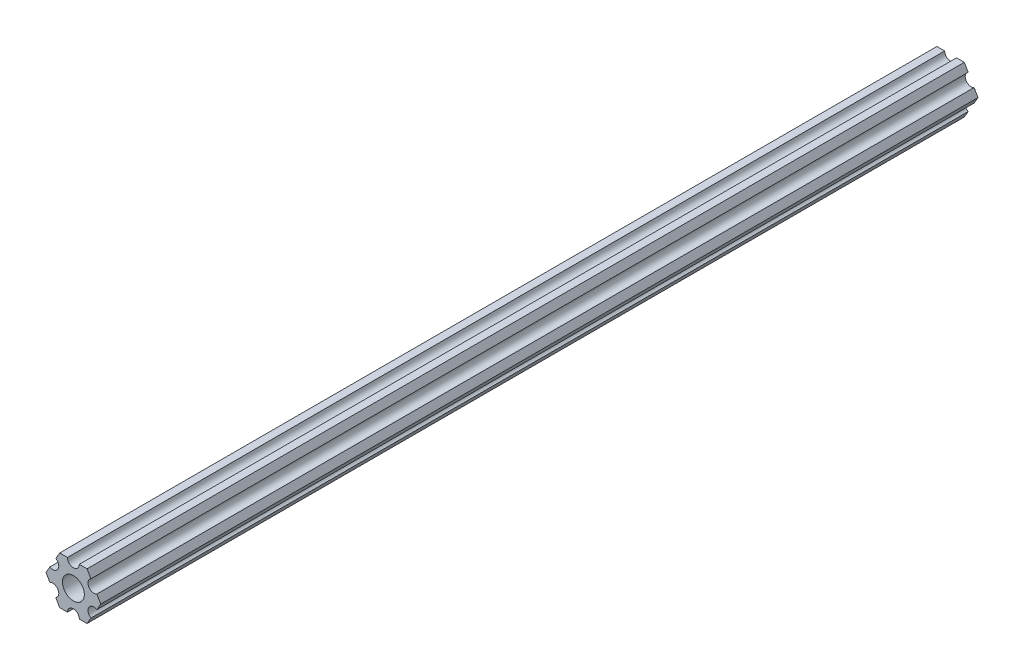
ISO-10303-21;
HEADER;
FILE_DESCRIPTION(('STEP AP214'),'2;1');
FILE_NAME('part.step','',(''),(''),'','','');
FILE_SCHEMA(('AUTOMOTIVE_DESIGN { 1 0 10303 214 1 1 1 1 }'));
ENDSEC;
DATA;
#1=APPLICATION_CONTEXT('core data for automotive mechanical design processes');
#2=APPLICATION_PROTOCOL_DEFINITION('international standard','automotive_design',2000,#1);
#3=PRODUCT_CONTEXT('',#1,'mechanical');
#4=PRODUCT('Part','Part','',(#3));
#5=PRODUCT_RELATED_PRODUCT_CATEGORY('part','',(#4));
#6=PRODUCT_DEFINITION_FORMATION('','',#4);
#7=PRODUCT_DEFINITION_CONTEXT('part definition',#1,'design');
#8=PRODUCT_DEFINITION('design','',#6,#7);
#9=PRODUCT_DEFINITION_SHAPE('','',#8);
#10=(LENGTH_UNIT() NAMED_UNIT(*) SI_UNIT(.MILLI.,.METRE.));
#11=(NAMED_UNIT(*) PLANE_ANGLE_UNIT() SI_UNIT($,.RADIAN.));
#12=(NAMED_UNIT(*) SI_UNIT($,.STERADIAN.) SOLID_ANGLE_UNIT());
#13=UNCERTAINTY_MEASURE_WITH_UNIT(LENGTH_MEASURE(1.E-05),#10,'distance_accuracy_value','');
#14=(GEOMETRIC_REPRESENTATION_CONTEXT(3) GLOBAL_UNCERTAINTY_ASSIGNED_CONTEXT((#13)) GLOBAL_UNIT_ASSIGNED_CONTEXT((#10,
#11,#12)) REPRESENTATION_CONTEXT('',''));
#15=CARTESIAN_POINT('',(0.,0.,0.));
#16=DIRECTION('',(0.,0.,1.));
#17=DIRECTION('',(1.,0.,0.));
#18=AXIS2_PLACEMENT_3D('',#15,#16,#17);
#19=CARTESIAN_POINT('',(6.29301142309098,-1.80018429024546,85.725));
#20=DIRECTION('',(-0.866025434075723,0.499999947533953,0.));
#21=DIRECTION('',(0.,0.,1.));
#22=AXIS2_PLACEMENT_3D('',#19,#20,#21);
#23=PLANE('',#22);
#24=DIRECTION('',(0.,0.,1.));
#25=VECTOR('',#24,1.);
#26=CARTESIAN_POINT('',(7.33234841870827,4.44212519169686E-07,85.725));
#27=LINE('',#26,#25);
#28=CARTESIAN_POINT('',(7.33234841870826,4.44212518961143E-07,-149.225));
#29=VERTEX_POINT('',#28);
#30=CARTESIAN_POINT('',(7.33234841870826,4.44212519315656E-07,85.725));
#31=VERTEX_POINT('',#30);
#32=EDGE_CURVE('E11',#29,#31,#27,.T.);
#33=ORIENTED_EDGE('',*,*,#32,.T.);
#34=DIRECTION('',(0.499999947533953,0.866025434075723,0.));
#35=VECTOR('',#34,1.);
#36=CARTESIAN_POINT('',(6.29301142309098,-1.80018429024546,85.725));
#37=LINE('',#36,#35);
#38=CARTESIAN_POINT('',(6.29301142309098,-1.80018429024546,85.725));
#39=VERTEX_POINT('',#38);
#40=EDGE_CURVE('E301',#39,#31,#37,.T.);
#41=ORIENTED_EDGE('',*,*,#40,.F.);
#42=DIRECTION('',(0.,0.,-1.));
#43=VECTOR('',#42,1.);
#44=CARTESIAN_POINT('',(6.29301142309098,-1.80018429024546,85.725));
#45=LINE('',#44,#43);
#46=CARTESIAN_POINT('',(6.29301142309098,-1.80018429024546,-149.225));
#47=VERTEX_POINT('',#46);
#48=EDGE_CURVE('E300',#39,#47,#45,.T.);
#49=ORIENTED_EDGE('',*,*,#48,.T.);
#50=DIRECTION('',(-0.499999947533953,-0.866025434075723,0.));
#51=VECTOR('',#50,1.);
#52=CARTESIAN_POINT('',(6.29301142309098,-1.80018429024546,-149.225));
#53=LINE('',#52,#51);
#54=EDGE_CURVE('E219',#29,#47,#53,.T.);
#55=ORIENTED_EDGE('',*,*,#54,.F.);
#56=EDGE_LOOP('',(#33,#41,#49,#55));
#57=FACE_BOUND('',#56,.T.);
#58=ADVANCED_FACE('F51',(#57),#23,.F.);
#59=CARTESIAN_POINT('',(7.33234841870827,4.44212519169686E-07,85.725));
#60=DIRECTION('',(-0.866025373493145,-0.500000052466057,0.));
#61=DIRECTION('',(-0.500000052466057,0.866025373493145,0.));
#62=AXIS2_PLACEMENT_3D('',#59,#60,#61);
#63=PLANE('',#62);
#64=DIRECTION('',(0.,0.,1.));
#65=VECTOR('',#64,1.);
#66=CARTESIAN_POINT('',(6.29301120497139,1.80018505273894,85.725));
#67=LINE('',#66,#65);
#68=CARTESIAN_POINT('',(6.29301120497139,1.80018505273894,-149.225));
#69=VERTEX_POINT('',#68);
#70=CARTESIAN_POINT('',(6.29301120497139,1.80018505273894,85.725));
#71=VERTEX_POINT('',#70);
#72=EDGE_CURVE('E59',#69,#71,#67,.T.);
#73=ORIENTED_EDGE('',*,*,#72,.T.);
#74=DIRECTION('',(-0.500000052466057,0.866025373493145,0.));
#75=VECTOR('',#74,1.);
#76=CARTESIAN_POINT('',(7.33234841870827,4.44212519198906E-07,85.725));
#77=LINE('',#76,#75);
#78=EDGE_CURVE('E305',#31,#71,#77,.T.);
#79=ORIENTED_EDGE('',*,*,#78,.F.);
#80=ORIENTED_EDGE('',*,*,#32,.F.);
#81=DIRECTION('',(0.500000052466055,-0.866025373493145,0.));
#82=VECTOR('',#81,1.);
#83=CARTESIAN_POINT('',(7.33234841870826,4.44212518961143E-07,-149.225));
#84=LINE('',#83,#82);
#85=EDGE_CURVE('E213',#69,#29,#84,.T.);
#86=ORIENTED_EDGE('',*,*,#85,.F.);
#87=EDGE_LOOP('',(#73,#79,#80,#86));
#88=FACE_BOUND('',#87,.T.);
#89=ADVANCED_FACE('F214',(#88),#63,.F.);
#90=CARTESIAN_POINT('',(4.70551103839172,4.54981561357972,85.725));
#91=DIRECTION('',(-0.866025373493151,-0.500000052466046,0.));
#92=DIRECTION('',(-0.500000052466046,0.866025373493151,0.));
#93=AXIS2_PLACEMENT_3D('',#90,#91,#92);
#94=PLANE('',#93);
#95=DIRECTION('',(0.,0.,1.));
#96=VECTOR('',#95,1.);
#97=CARTESIAN_POINT('',(3.66617382465481,6.35000022210627,85.725));
#98=LINE('',#97,#96);
#99=CARTESIAN_POINT('',(3.66617382465481,6.35000022210627,-149.225));
#100=VERTEX_POINT('',#99);
#101=CARTESIAN_POINT('',(3.66617382465481,6.35000022210627,85.725));
#102=VERTEX_POINT('',#101);
#103=EDGE_CURVE('E211',#100,#102,#98,.T.);
#104=ORIENTED_EDGE('',*,*,#103,.T.);
#105=DIRECTION('',(-0.500000052466046,0.866025373493151,0.));
#106=VECTOR('',#105,1.);
#107=CARTESIAN_POINT('',(4.70551103839172,4.54981561357972,85.725));
#108=LINE('',#107,#106);
#109=CARTESIAN_POINT('',(4.70551103839172,4.54981561357972,85.725));
#110=VERTEX_POINT('',#109);
#111=EDGE_CURVE('E336',#110,#102,#108,.T.);
#112=ORIENTED_EDGE('',*,*,#111,.F.);
#113=DIRECTION('',(0.,0.,1.));
#114=VECTOR('',#113,1.);
#115=CARTESIAN_POINT('',(4.70551103839172,4.54981561357972,85.725));
#116=LINE('',#115,#114);
#117=CARTESIAN_POINT('',(4.70551103839172,4.54981561357972,-149.225));
#118=VERTEX_POINT('',#117);
#119=EDGE_CURVE('E299',#118,#110,#116,.T.);
#120=ORIENTED_EDGE('',*,*,#119,.F.);
#121=DIRECTION('',(0.500000052466045,-0.866025373493151,0.));
#122=VECTOR('',#121,1.);
#123=CARTESIAN_POINT('',(4.70551103839172,4.54981561357972,-149.225));
#124=LINE('',#123,#122);
#125=EDGE_CURVE('E225',#100,#118,#124,.T.);
#126=ORIENTED_EDGE('',*,*,#125,.F.);
#127=EDGE_LOOP('',(#104,#112,#120,#126));
#128=FACE_BOUND('',#127,.T.);
#129=ADVANCED_FACE('F412',(#128),#94,.F.);
#130=CARTESIAN_POINT('',(3.66617382465481,6.35000022210627,85.725));
#131=DIRECTION('',(6.05825850611185E-08,-1.,0.));
#132=DIRECTION('',(0.,0.,-1.));
#133=AXIS2_PLACEMENT_3D('',#130,#131,#132);
#134=PLANE('',#133);
#135=DIRECTION('',(0.,0.,1.));
#136=VECTOR('',#135,1.);
#137=CARTESIAN_POINT('',(1.58749961530074,6.35000009617482,85.725));
#138=LINE('',#137,#136);
#139=CARTESIAN_POINT('',(1.58749961530073,6.35000015914054,-149.225));
#140=VERTEX_POINT('',#139);
#141=CARTESIAN_POINT('',(1.58749961530073,6.35000015914054,85.725));
#142=VERTEX_POINT('',#141);
#143=EDGE_CURVE('E333',#140,#142,#138,.T.);
#144=ORIENTED_EDGE('',*,*,#143,.T.);
#145=DIRECTION('',(-1.,0.,0.));
#146=VECTOR('',#145,1.);
#147=CARTESIAN_POINT('',(5.49926112168156,6.35000022210627,85.725));
#148=LINE('',#147,#146);
#149=EDGE_CURVE('E340',#102,#142,#148,.T.);
#150=ORIENTED_EDGE('',*,*,#149,.F.);
#151=ORIENTED_EDGE('',*,*,#103,.F.);
#152=DIRECTION('',(1.,3.02912931564594E-08,0.));
#153=VECTOR('',#152,1.);
#154=CARTESIAN_POINT('',(3.66617382465481,6.35000022210627,-149.225));
#155=LINE('',#154,#153);
#156=EDGE_CURVE('E287',#140,#100,#155,.T.);
#157=ORIENTED_EDGE('',*,*,#156,.F.);
#158=EDGE_LOOP('',(#144,#150,#151,#157));
#159=FACE_BOUND('',#158,.T.);
#160=ADVANCED_FACE('F415',(#159),#134,.F.);
#161=CARTESIAN_POINT('',(-3.84699260060323E-07,6.35,85.725));
#162=DIRECTION('',(0.,0.,-1.));
#163=DIRECTION('',(-1.,0.,0.));
#164=AXIS2_PLACEMENT_3D('',#161,#162,#163);
#165=CYLINDRICAL_SURFACE('',#164,1.5875);
#166=DIRECTION('',(0.,0.,1.));
#167=VECTOR('',#166,1.);
#168=CARTESIAN_POINT('',(-1.58750038469926,6.34999990382518,85.725));
#169=LINE('',#168,#167);
#170=CARTESIAN_POINT('',(-1.58750038469926,6.34999990382519,-149.225));
#171=VERTEX_POINT('',#170);
#172=CARTESIAN_POINT('',(-1.58750038469926,6.34999990382519,85.725));
#173=VERTEX_POINT('',#172);
#174=EDGE_CURVE('E330',#171,#173,#169,.T.);
#175=ORIENTED_EDGE('',*,*,#174,.T.);
#176=CARTESIAN_POINT('',(-3.84699260060323E-07,6.35,85.725));
#177=DIRECTION('',(0.,0.,-1.));
#178=DIRECTION('',(-1.,0.,0.));
#179=AXIS2_PLACEMENT_3D('',#176,#177,#178);
#180=CIRCLE('',#179,1.5875);
#181=EDGE_CURVE('E344',#142,#173,#180,.T.);
#182=ORIENTED_EDGE('',*,*,#181,.F.);
#183=ORIENTED_EDGE('',*,*,#143,.F.);
#184=CARTESIAN_POINT('',(-3.84699260060323E-07,6.35,-149.225));
#185=DIRECTION('',(0.,0.,1.));
#186=DIRECTION('',(-1.,0.,0.));
#187=AXIS2_PLACEMENT_3D('',#184,#185,#186);
#188=CIRCLE('',#187,1.5875);
#189=EDGE_CURVE('E283',#171,#140,#188,.T.);
#190=ORIENTED_EDGE('',*,*,#189,.F.);
#191=EDGE_LOOP('',(#175,#182,#183,#190));
#192=FACE_BOUND('',#191,.T.);
#193=ADVANCED_FACE('F464',(#192),#165,.F.);
#194=CARTESIAN_POINT('',(-1.58750038469926,6.34999990382518,85.725));
#195=DIRECTION('',(6.05825963273174E-08,-1.,0.));
#196=DIRECTION('',(0.,0.,-1.));
#197=AXIS2_PLACEMENT_3D('',#194,#195,#196);
#198=PLANE('',#197);
#199=DIRECTION('',(0.,0.,1.));
#200=VECTOR('',#199,1.);
#201=CARTESIAN_POINT('',(-3.66617459405349,6.3499997778937,85.725));
#202=LINE('',#201,#200);
#203=CARTESIAN_POINT('',(-3.66617454558244,6.34999986184803,-149.225));
#204=VERTEX_POINT('',#203);
#205=CARTESIAN_POINT('',(-3.66617454558244,6.34999986184803,85.725));
#206=VERTEX_POINT('',#205);
#207=EDGE_CURVE('E323',#204,#206,#202,.T.);
#208=ORIENTED_EDGE('',*,*,#207,.T.);
#209=DIRECTION('',(-1.,0.,0.));
#210=VECTOR('',#209,1.);
#211=CARTESIAN_POINT('',(5.49926112168156,6.34999990382519,85.725));
#212=LINE('',#211,#210);
#213=EDGE_CURVE('E348',#173,#206,#212,.T.);
#214=ORIENTED_EDGE('',*,*,#213,.F.);
#215=ORIENTED_EDGE('',*,*,#174,.F.);
#216=DIRECTION('',(1.,2.0194198968488E-08,0.));
#217=VECTOR('',#216,1.);
#218=CARTESIAN_POINT('',(-1.58750038469926,6.34999990382519,-149.225));
#219=LINE('',#218,#217);
#220=EDGE_CURVE('E279',#204,#171,#219,.T.);
#221=ORIENTED_EDGE('',*,*,#220,.F.);
#222=EDGE_LOOP('',(#208,#214,#215,#221));
#223=FACE_BOUND('',#222,.T.);
#224=ADVANCED_FACE('F461',(#223),#198,.F.);
#225=CARTESIAN_POINT('',(-3.66617459405349,6.3499997778937,85.725));
#226=DIRECTION('',(0.866025434075729,-0.499999947533942,0.));
#227=DIRECTION('',(0.,0.,-1.));
#228=AXIS2_PLACEMENT_3D('',#225,#226,#227);
#229=PLANE('',#228);
#230=DIRECTION('',(0.,0.,1.));
#231=VECTOR('',#230,1.);
#232=CARTESIAN_POINT('',(-4.70551158967065,4.54981504343587,85.725));
#233=LINE('',#232,#231);
#234=CARTESIAN_POINT('',(-4.70551158967065,4.54981504343587,-149.225));
#235=VERTEX_POINT('',#234);
#236=CARTESIAN_POINT('',(-4.70551158967065,4.54981504343587,85.725));
#237=VERTEX_POINT('',#236);
#238=EDGE_CURVE('E320',#235,#237,#233,.T.);
#239=ORIENTED_EDGE('',*,*,#238,.T.);
#240=DIRECTION('',(-0.499999947533943,-0.866025434075729,0.));
#241=VECTOR('',#240,1.);
#242=CARTESIAN_POINT('',(-3.66617459405349,6.3499997778937,85.725));
#243=LINE('',#242,#241);
#244=EDGE_CURVE('E352',#206,#237,#243,.T.);
#245=ORIENTED_EDGE('',*,*,#244,.F.);
#246=ORIENTED_EDGE('',*,*,#207,.F.);
#247=DIRECTION('',(0.499999947533939,0.866025434075731,0.));
#248=VECTOR('',#247,1.);
#249=CARTESIAN_POINT('',(-3.66617454558244,6.34999986184803,-149.225));
#250=LINE('',#249,#248);
#251=EDGE_CURVE('E275',#235,#204,#250,.T.);
#252=ORIENTED_EDGE('',*,*,#251,.F.);
#253=EDGE_LOOP('',(#239,#245,#246,#252));
#254=FACE_BOUND('',#253,.T.);
#255=ADVANCED_FACE('F457',(#254),#229,.F.);
#256=CARTESIAN_POINT('',(-5.49926150638082,3.17499966684067,85.725));
#257=DIRECTION('',(0.,0.,-1.));
#258=DIRECTION('',(-1.,0.,0.));
#259=AXIS2_PLACEMENT_3D('',#256,#257,#258);
#260=CYLINDRICAL_SURFACE('',#259,1.5875);
#261=DIRECTION('',(0.,0.,1.));
#262=VECTOR('',#261,1.);
#263=CARTESIAN_POINT('',(-6.29301142309098,1.80018429024547,85.725));
#264=LINE('',#263,#262);
#265=CARTESIAN_POINT('',(-6.29301142309098,1.80018429024546,-149.225));
#266=VERTEX_POINT('',#265);
#267=CARTESIAN_POINT('',(-6.29301142309098,1.80018429024547,85.725));
#268=VERTEX_POINT('',#267);
#269=EDGE_CURVE('E324',#266,#268,#264,.T.);
#270=ORIENTED_EDGE('',*,*,#269,.T.);
#271=CARTESIAN_POINT('',(-5.49926150638082,3.17499966684067,85.725));
#272=DIRECTION('',(0.,0.,-1.));
#273=DIRECTION('',(-1.,0.,0.));
#274=AXIS2_PLACEMENT_3D('',#271,#272,#273);
#275=CIRCLE('',#274,1.5875);
#276=EDGE_CURVE('E362',#237,#268,#275,.T.);
#277=ORIENTED_EDGE('',*,*,#276,.F.);
#278=ORIENTED_EDGE('',*,*,#238,.F.);
#279=CARTESIAN_POINT('',(-5.49926150638082,3.17499966684067,-149.225));
#280=DIRECTION('',(0.,0.,1.));
#281=DIRECTION('',(-1.,0.,0.));
#282=AXIS2_PLACEMENT_3D('',#279,#280,#281);
#283=CIRCLE('',#282,1.5875);
#284=EDGE_CURVE('E271',#266,#235,#283,.T.);
#285=ORIENTED_EDGE('',*,*,#284,.F.);
#286=EDGE_LOOP('',(#270,#277,#278,#285));
#287=FACE_BOUND('',#286,.T.);
#288=ADVANCED_FACE('F453',(#287),#260,.F.);
#289=CARTESIAN_POINT('',(-6.29301142309098,1.80018429024547,85.725));
#290=DIRECTION('',(0.866025434075724,-0.499999947533952,0.));
#291=DIRECTION('',(0.,0.,-1.));
#292=AXIS2_PLACEMENT_3D('',#289,#290,#291);
#293=PLANE('',#292);
#294=DIRECTION('',(0.,0.,1.));
#295=VECTOR('',#294,1.);
#296=CARTESIAN_POINT('',(-7.33234841870827,-4.44212523790841E-07,85.725));
#297=LINE('',#296,#295);
#298=CARTESIAN_POINT('',(-7.33234841870826,-4.44212524036367E-07,-149.225));
#299=VERTEX_POINT('',#298);
#300=CARTESIAN_POINT('',(-7.33234841870826,-4.44212524036367E-07,85.725));
#301=VERTEX_POINT('',#300);
#302=EDGE_CURVE('E317',#299,#301,#297,.T.);
#303=ORIENTED_EDGE('',*,*,#302,.T.);
#304=DIRECTION('',(-0.499999947533952,-0.866025434075724,0.));
#305=VECTOR('',#304,1.);
#306=CARTESIAN_POINT('',(-6.29301142309098,1.80018429024547,85.725));
#307=LINE('',#306,#305);
#308=EDGE_CURVE('E358',#268,#301,#307,.T.);
#309=ORIENTED_EDGE('',*,*,#308,.F.);
#310=ORIENTED_EDGE('',*,*,#269,.F.);
#311=DIRECTION('',(0.499999947533951,0.866025434075724,0.));
#312=VECTOR('',#311,1.);
#313=CARTESIAN_POINT('',(-6.29301142309098,1.80018429024547,-149.225));
#314=LINE('',#313,#312);
#315=EDGE_CURVE('E267',#299,#266,#314,.T.);
#316=ORIENTED_EDGE('',*,*,#315,.F.);
#317=EDGE_LOOP('',(#303,#309,#310,#316));
#318=FACE_BOUND('',#317,.T.);
#319=ADVANCED_FACE('F449',(#318),#293,.F.);
#320=CARTESIAN_POINT('',(-7.33234841870827,-4.44212523790841E-07,85.725));
#321=DIRECTION('',(0.866025373493151,0.500000052466045,0.));
#322=DIRECTION('',(0.,0.,-1.));
#323=AXIS2_PLACEMENT_3D('',#320,#321,#322);
#324=PLANE('',#323);
#325=DIRECTION('',(0.,0.,1.));
#326=VECTOR('',#325,1.);
#327=CARTESIAN_POINT('',(-6.29301120497141,-1.80018505273897,85.725));
#328=LINE('',#327,#326);
#329=CARTESIAN_POINT('',(-6.29301120497141,-1.80018505273897,-149.225));
#330=VERTEX_POINT('',#329);
#331=CARTESIAN_POINT('',(-6.29301120497141,-1.80018505273897,85.725));
#332=VERTEX_POINT('',#331);
#333=EDGE_CURVE('E310',#330,#332,#328,.T.);
#334=ORIENTED_EDGE('',*,*,#333,.T.);
#335=DIRECTION('',(0.500000052466045,-0.866025373493151,0.));
#336=VECTOR('',#335,1.);
#337=CARTESIAN_POINT('',(-7.33234841870827,-4.44212523969395E-07,85.725));
#338=LINE('',#337,#336);
#339=EDGE_CURVE('E353',#301,#332,#338,.T.);
#340=ORIENTED_EDGE('',*,*,#339,.F.);
#341=ORIENTED_EDGE('',*,*,#302,.F.);
#342=DIRECTION('',(-0.500000052466045,0.866025373493152,0.));
#343=VECTOR('',#342,1.);
#344=CARTESIAN_POINT('',(-7.33234841870826,-4.44212524036367E-07,-149.225));
#345=LINE('',#344,#343);
#346=EDGE_CURVE('E263',#330,#299,#345,.T.);
#347=ORIENTED_EDGE('',*,*,#346,.F.);
#348=EDGE_LOOP('',(#334,#340,#341,#347));
#349=FACE_BOUND('',#348,.T.);
#350=ADVANCED_FACE('F445',(#349),#324,.F.);
#351=CARTESIAN_POINT('',(-5.49926112168156,-3.17500033315934,85.725));
#352=DIRECTION('',(0.,0.,-1.));
#353=DIRECTION('',(-1.,0.,0.));
#354=AXIS2_PLACEMENT_3D('',#351,#352,#353);
#355=CYLINDRICAL_SURFACE('',#354,1.5875);
#356=DIRECTION('',(0.,0.,1.));
#357=VECTOR('',#356,1.);
#358=CARTESIAN_POINT('',(-4.70551103839172,-4.54981561357972,85.725));
#359=LINE('',#358,#357);
#360=CARTESIAN_POINT('',(-4.70551103839172,-4.54981561357972,-149.225));
#361=VERTEX_POINT('',#360);
#362=CARTESIAN_POINT('',(-4.70551103839172,-4.54981561357972,85.725));
#363=VERTEX_POINT('',#362);
#364=EDGE_CURVE('E307',#361,#363,#359,.T.);
#365=ORIENTED_EDGE('',*,*,#364,.T.);
#366=CARTESIAN_POINT('',(-5.49926112168156,-3.17500033315934,85.725));
#367=DIRECTION('',(0.,0.,-1.));
#368=DIRECTION('',(-1.,0.,0.));
#369=AXIS2_PLACEMENT_3D('',#366,#367,#368);
#370=CIRCLE('',#369,1.5875);
#371=EDGE_CURVE('E357',#332,#363,#370,.T.);
#372=ORIENTED_EDGE('',*,*,#371,.F.);
#373=ORIENTED_EDGE('',*,*,#333,.F.);
#374=CARTESIAN_POINT('',(-5.49926112168156,-3.17500033315934,-149.225));
#375=DIRECTION('',(0.,0.,1.));
#376=DIRECTION('',(-1.,0.,0.));
#377=AXIS2_PLACEMENT_3D('',#374,#375,#376);
#378=CIRCLE('',#377,1.5875);
#379=EDGE_CURVE('E259',#361,#330,#378,.T.);
#380=ORIENTED_EDGE('',*,*,#379,.F.);
#381=EDGE_LOOP('',(#365,#372,#373,#380));
#382=FACE_BOUND('',#381,.T.);
#383=ADVANCED_FACE('F441',(#382),#355,.F.);
#384=CARTESIAN_POINT('',(-4.70551103839172,-4.54981561357972,85.725));
#385=DIRECTION('',(0.866025373493152,0.500000052466045,0.));
#386=DIRECTION('',(0.,0.,-1.));
#387=AXIS2_PLACEMENT_3D('',#384,#385,#386);
#388=PLANE('',#387);
#389=DIRECTION('',(0.,0.,1.));
#390=VECTOR('',#389,1.);
#391=CARTESIAN_POINT('',(-3.66617382465481,-6.35000022210628,85.725));
#392=LINE('',#391,#390);
#393=CARTESIAN_POINT('',(-3.66617382465481,-6.35000022210628,-149.225));
#394=VERTEX_POINT('',#393);
#395=CARTESIAN_POINT('',(-3.66617382465481,-6.35000022210628,85.725));
#396=VERTEX_POINT('',#395);
#397=EDGE_CURVE('E311',#394,#396,#392,.T.);
#398=ORIENTED_EDGE('',*,*,#397,.T.);
#399=DIRECTION('',(0.500000052466045,-0.866025373493151,0.));
#400=VECTOR('',#399,1.);
#401=CARTESIAN_POINT('',(-4.70551103839172,-4.54981561357972,85.725));
#402=LINE('',#401,#400);
#403=EDGE_CURVE('E372',#363,#396,#402,.T.);
#404=ORIENTED_EDGE('',*,*,#403,.F.);
#405=ORIENTED_EDGE('',*,*,#364,.F.);
#406=DIRECTION('',(-0.500000052466043,0.866025373493152,0.));
#407=VECTOR('',#406,1.);
#408=CARTESIAN_POINT('',(-4.70551103839172,-4.54981561357972,-149.225));
#409=LINE('',#408,#407);
#410=EDGE_CURVE('E255',#394,#361,#409,.T.);
#411=ORIENTED_EDGE('',*,*,#410,.F.);
#412=EDGE_LOOP('',(#398,#404,#405,#411));
#413=FACE_BOUND('',#412,.T.);
#414=ADVANCED_FACE('F437',(#413),#388,.F.);
#415=CARTESIAN_POINT('',(-3.66617382465481,-6.35000022210628,85.725));
#416=DIRECTION('',(-6.05825854783851E-08,1.,0.));
#417=DIRECTION('',(0.,0.,1.));
#418=AXIS2_PLACEMENT_3D('',#415,#416,#417);
#419=PLANE('',#418);
#420=DIRECTION('',(0.,0.,1.));
#421=VECTOR('',#420,1.);
#422=CARTESIAN_POINT('',(-1.58749961530074,-6.35,85.725));
#423=LINE('',#422,#421);
#424=CARTESIAN_POINT('',(-1.58749961530073,-6.35000011105314,-149.225));
#425=VERTEX_POINT('',#424);
#426=CARTESIAN_POINT('',(-1.58749961530073,-6.35000011105314,85.725));
#427=VERTEX_POINT('',#426);
#428=EDGE_CURVE('E82',#425,#427,#423,.T.);
#429=ORIENTED_EDGE('',*,*,#428,.T.);
#430=DIRECTION('',(1.,0.,0.));
#431=VECTOR('',#430,1.);
#432=CARTESIAN_POINT('',(5.49926112168156,-6.35000022210628,85.725));
#433=LINE('',#432,#431);
#434=EDGE_CURVE('E376',#396,#427,#433,.T.);
#435=ORIENTED_EDGE('',*,*,#434,.F.);
#436=ORIENTED_EDGE('',*,*,#397,.F.);
#437=DIRECTION('',(-0.999999999999999,-5.34249856349036E-08,0.));
#438=VECTOR('',#437,1.);
#439=CARTESIAN_POINT('',(-3.66617382465481,-6.35000022210628,-149.225));
#440=LINE('',#439,#438);
#441=EDGE_CURVE('E251',#425,#394,#440,.T.);
#442=ORIENTED_EDGE('',*,*,#441,.F.);
#443=EDGE_LOOP('',(#429,#435,#436,#442));
#444=FACE_BOUND('',#443,.T.);
#445=ADVANCED_FACE('F434',(#444),#419,.F.);
#446=CARTESIAN_POINT('',(3.8469926204343E-07,-6.35,85.725));
#447=DIRECTION('',(0.,0.,-1.));
#448=DIRECTION('',(-1.,0.,0.));
#449=AXIS2_PLACEMENT_3D('',#446,#447,#448);
#450=CYLINDRICAL_SURFACE('',#449,1.5875);
#451=DIRECTION('',(0.,0.,1.));
#452=VECTOR('',#451,1.);
#453=CARTESIAN_POINT('',(1.58750038469926,-6.34999990382518,85.725));
#454=LINE('',#453,#452);
#455=CARTESIAN_POINT('',(1.58750038469926,-6.34999990382519,-149.225));
#456=VERTEX_POINT('',#455);
#457=CARTESIAN_POINT('',(1.58750038469926,-6.34999990382519,85.725));
#458=VERTEX_POINT('',#457);
#459=EDGE_CURVE('E71',#456,#458,#454,.T.);
#460=ORIENTED_EDGE('',*,*,#459,.T.);
#461=CARTESIAN_POINT('',(3.8469926204343E-07,-6.35,85.725));
#462=DIRECTION('',(0.,0.,-1.));
#463=DIRECTION('',(-1.,0.,0.));
#464=AXIS2_PLACEMENT_3D('',#461,#462,#463);
#465=CIRCLE('',#464,1.5875);
#466=EDGE_CURVE('E380',#427,#458,#465,.T.);
#467=ORIENTED_EDGE('',*,*,#466,.F.);
#468=ORIENTED_EDGE('',*,*,#428,.F.);
#469=CARTESIAN_POINT('',(3.8469926204343E-07,-6.35,-149.225));
#470=DIRECTION('',(0.,0.,1.));
#471=DIRECTION('',(-1.,0.,0.));
#472=AXIS2_PLACEMENT_3D('',#469,#470,#471);
#473=CIRCLE('',#472,1.5875);
#474=EDGE_CURVE('E247',#456,#425,#473,.T.);
#475=ORIENTED_EDGE('',*,*,#474,.F.);
#476=EDGE_LOOP('',(#460,#467,#468,#475));
#477=FACE_BOUND('',#476,.T.);
#478=ADVANCED_FACE('F432',(#477),#450,.F.);
#479=CARTESIAN_POINT('',(1.58750038469926,-6.34999990382518,85.725));
#480=DIRECTION('',(-6.05825721258438E-08,1.,0.));
#481=DIRECTION('',(0.,0.,1.));
#482=AXIS2_PLACEMENT_3D('',#479,#480,#481);
#483=PLANE('',#482);
#484=DIRECTION('',(0.,0.,1.));
#485=VECTOR('',#484,1.);
#486=CARTESIAN_POINT('',(3.66617459405346,-6.34999977789375,85.725));
#487=LINE('',#486,#485);
#488=CARTESIAN_POINT('',(3.66617454558244,-6.34999986184804,-149.225));
#489=VERTEX_POINT('',#488);
#490=CARTESIAN_POINT('',(3.66617454558244,-6.34999986184804,85.725));
#491=VERTEX_POINT('',#490);
#492=EDGE_CURVE('E381',#489,#491,#487,.T.);
#493=ORIENTED_EDGE('',*,*,#492,.T.);
#494=DIRECTION('',(1.,0.,0.));
#495=VECTOR('',#494,1.);
#496=CARTESIAN_POINT('',(5.49926112168156,-6.34999990382519,85.725));
#497=LINE('',#496,#495);
#498=EDGE_CURVE('E388',#458,#491,#497,.T.);
#499=ORIENTED_EDGE('',*,*,#498,.F.);
#500=ORIENTED_EDGE('',*,*,#459,.F.);
#501=DIRECTION('',(-1.,-2.01941943785532E-08,0.));
#502=VECTOR('',#501,1.);
#503=CARTESIAN_POINT('',(1.58750038469926,-6.34999990382519,-149.225));
#504=LINE('',#503,#502);
#505=EDGE_CURVE('E243',#489,#456,#504,.T.);
#506=ORIENTED_EDGE('',*,*,#505,.F.);
#507=EDGE_LOOP('',(#493,#499,#500,#506));
#508=FACE_BOUND('',#507,.T.);
#509=ADVANCED_FACE('F431',(#508),#483,.F.);
#510=CARTESIAN_POINT('',(3.66617459405346,-6.34999977789375,85.725));
#511=DIRECTION('',(-0.86602543407573,0.499999947533941,0.));
#512=DIRECTION('',(0.,0.,1.));
#513=AXIS2_PLACEMENT_3D('',#510,#511,#512);
#514=PLANE('',#513);
#515=DIRECTION('',(0.,0.,-1.));
#516=VECTOR('',#515,1.);
#517=CARTESIAN_POINT('',(4.70551158967065,-4.54981504343587,85.725));
#518=LINE('',#517,#516);
#519=CARTESIAN_POINT('',(4.70551158967065,-4.54981504343587,85.725));
#520=VERTEX_POINT('',#519);
#521=CARTESIAN_POINT('',(4.70551158967065,-4.54981504343587,-149.225));
#522=VERTEX_POINT('',#521);
#523=EDGE_CURVE('E384',#520,#522,#518,.T.);
#524=ORIENTED_EDGE('',*,*,#523,.F.);
#525=DIRECTION('',(0.49999994753394,0.86602543407573,0.));
#526=VECTOR('',#525,1.);
#527=CARTESIAN_POINT('',(3.66617459405346,-6.34999977789376,85.725));
#528=LINE('',#527,#526);
#529=EDGE_CURVE('E306',#491,#520,#528,.T.);
#530=ORIENTED_EDGE('',*,*,#529,.F.);
#531=ORIENTED_EDGE('',*,*,#492,.F.);
#532=DIRECTION('',(-0.499999947533941,-0.86602543407573,0.));
#533=VECTOR('',#532,1.);
#534=CARTESIAN_POINT('',(3.66617454558244,-6.34999986184804,-149.225));
#535=LINE('',#534,#533);
#536=EDGE_CURVE('E239',#522,#489,#535,.T.);
#537=ORIENTED_EDGE('',*,*,#536,.F.);
#538=EDGE_LOOP('',(#524,#530,#531,#537));
#539=FACE_BOUND('',#538,.T.);
#540=ADVANCED_FACE('F428',(#539),#514,.F.);
#541=CARTESIAN_POINT('',(5.49926112168156,3.17500033315934,85.725));
#542=DIRECTION('',(0.,0.,1.));
#543=DIRECTION('',(1.,0.,0.));
#544=AXIS2_PLACEMENT_3D('',#541,#542,#543);
#545=PLANE('',#544);
#546=CARTESIAN_POINT('',(0.,0.,85.725));
#547=DIRECTION('',(0.,0.,-1.));
#548=DIRECTION('',(-1.,0.,0.));
#549=AXIS2_PLACEMENT_3D('',#546,#547,#548);
#550=CIRCLE('',#549,2.9337);
#551=CARTESIAN_POINT('',(-2.9337,0.,85.725));
#552=VERTEX_POINT('',#551);
#553=EDGE_CURVE('E292',#552,#552,#550,.T.);
#554=ORIENTED_EDGE('',*,*,#553,.T.);
#555=EDGE_LOOP('',(#554));
#556=FACE_BOUND('',#555,.T.);
#557=ORIENTED_EDGE('',*,*,#529,.T.);
#558=CARTESIAN_POINT('',(5.49926150638082,-3.17499966684067,85.725));
#559=DIRECTION('',(0.,0.,-1.));
#560=DIRECTION('',(-1.,0.,0.));
#561=AXIS2_PLACEMENT_3D('',#558,#559,#560);
#562=CIRCLE('',#561,1.5875);
#563=EDGE_CURVE('E296',#520,#39,#562,.T.);
#564=ORIENTED_EDGE('',*,*,#563,.T.);
#565=ORIENTED_EDGE('',*,*,#40,.T.);
#566=ORIENTED_EDGE('',*,*,#78,.T.);
#567=CARTESIAN_POINT('',(5.49926112168156,3.17500033315934,85.725));
#568=DIRECTION('',(0.,0.,-1.));
#569=DIRECTION('',(-1.,0.,0.));
#570=AXIS2_PLACEMENT_3D('',#567,#568,#569);
#571=CIRCLE('',#570,1.5875);
#572=EDGE_CURVE('E206',#71,#110,#571,.T.);
#573=ORIENTED_EDGE('',*,*,#572,.T.);
#574=ORIENTED_EDGE('',*,*,#111,.T.);
#575=ORIENTED_EDGE('',*,*,#149,.T.);
#576=ORIENTED_EDGE('',*,*,#181,.T.);
#577=ORIENTED_EDGE('',*,*,#213,.T.);
#578=ORIENTED_EDGE('',*,*,#244,.T.);
#579=ORIENTED_EDGE('',*,*,#276,.T.);
#580=ORIENTED_EDGE('',*,*,#308,.T.);
#581=ORIENTED_EDGE('',*,*,#339,.T.);
#582=ORIENTED_EDGE('',*,*,#371,.T.);
#583=ORIENTED_EDGE('',*,*,#403,.T.);
#584=ORIENTED_EDGE('',*,*,#434,.T.);
#585=ORIENTED_EDGE('',*,*,#466,.T.);
#586=ORIENTED_EDGE('',*,*,#498,.T.);
#587=EDGE_LOOP('',(#557,#564,#565,#566,#573,#574,#575,#576,#577,#578,#579,#580,#581,#582,#583,
#584,#585,#586));
#588=FACE_BOUND('',#587,.T.);
#589=ADVANCED_FACE('F418',(#556,#588),#545,.T.);
#590=CARTESIAN_POINT('',(5.49926112168156,3.17500033315934,85.725));
#591=DIRECTION('',(0.,0.,-1.));
#592=DIRECTION('',(-1.,0.,0.));
#593=AXIS2_PLACEMENT_3D('',#590,#591,#592);
#594=CYLINDRICAL_SURFACE('',#593,1.5875);
#595=ORIENTED_EDGE('',*,*,#572,.F.);
#596=ORIENTED_EDGE('',*,*,#72,.F.);
#597=CARTESIAN_POINT('',(5.49926112168156,3.17500033315934,-149.225));
#598=DIRECTION('',(0.,0.,1.));
#599=DIRECTION('',(-1.,0.,0.));
#600=AXIS2_PLACEMENT_3D('',#597,#598,#599);
#601=CIRCLE('',#600,1.5875);
#602=EDGE_CURVE('E203',#118,#69,#601,.T.);
#603=ORIENTED_EDGE('',*,*,#602,.F.);
#604=ORIENTED_EDGE('',*,*,#119,.T.);
#605=EDGE_LOOP('',(#595,#596,#603,#604));
#606=FACE_BOUND('',#605,.T.);
#607=ADVANCED_FACE('F200',(#606),#594,.F.);
#608=CARTESIAN_POINT('',(5.49926150638082,-3.17499966684067,85.725));
#609=DIRECTION('',(0.,0.,-1.));
#610=DIRECTION('',(-1.,0.,0.));
#611=AXIS2_PLACEMENT_3D('',#608,#609,#610);
#612=CYLINDRICAL_SURFACE('',#611,1.5875);
#613=ORIENTED_EDGE('',*,*,#563,.F.);
#614=ORIENTED_EDGE('',*,*,#523,.T.);
#615=CARTESIAN_POINT('',(5.49926150638082,-3.17499966684067,-149.225));
#616=DIRECTION('',(0.,0.,1.));
#617=DIRECTION('',(-1.,0.,0.));
#618=AXIS2_PLACEMENT_3D('',#615,#616,#617);
#619=CIRCLE('',#618,1.5875);
#620=EDGE_CURVE('E235',#47,#522,#619,.T.);
#621=ORIENTED_EDGE('',*,*,#620,.F.);
#622=ORIENTED_EDGE('',*,*,#48,.F.);
#623=EDGE_LOOP('',(#613,#614,#621,#622));
#624=FACE_BOUND('',#623,.T.);
#625=ADVANCED_FACE('F423',(#624),#612,.F.);
#626=CARTESIAN_POINT('',(0.,0.,85.725));
#627=DIRECTION('',(0.,0.,-1.));
#628=DIRECTION('',(-1.,0.,0.));
#629=AXIS2_PLACEMENT_3D('',#626,#627,#628);
#630=CYLINDRICAL_SURFACE('',#629,2.9337);
#631=ORIENTED_EDGE('',*,*,#553,.F.);
#632=EDGE_LOOP('',(#631));
#633=FACE_BOUND('',#632,.T.);
#634=CARTESIAN_POINT('',(0.,0.,-149.225));
#635=DIRECTION('',(0.,0.,-1.));
#636=DIRECTION('',(-1.,0.,0.));
#637=AXIS2_PLACEMENT_3D('',#634,#635,#636);
#638=CIRCLE('',#637,2.9337);
#639=CARTESIAN_POINT('',(-2.9337,0.,-149.225));
#640=VERTEX_POINT('',#639);
#641=EDGE_CURVE('E227',#640,#640,#638,.T.);
#642=ORIENTED_EDGE('',*,*,#641,.T.);
#643=EDGE_LOOP('',(#642));
#644=FACE_BOUND('',#643,.T.);
#645=ADVANCED_FACE('F483',(#633,#644),#630,.F.);
#646=CARTESIAN_POINT('',(5.49926112168156,3.17500033315934,-149.225));
#647=DIRECTION('',(0.,0.,-1.));
#648=DIRECTION('',(-1.,0.,0.));
#649=AXIS2_PLACEMENT_3D('',#646,#647,#648);
#650=PLANE('',#649);
#651=ORIENTED_EDGE('',*,*,#602,.T.);
#652=ORIENTED_EDGE('',*,*,#85,.T.);
#653=ORIENTED_EDGE('',*,*,#54,.T.);
#654=ORIENTED_EDGE('',*,*,#620,.T.);
#655=ORIENTED_EDGE('',*,*,#536,.T.);
#656=ORIENTED_EDGE('',*,*,#505,.T.);
#657=ORIENTED_EDGE('',*,*,#474,.T.);
#658=ORIENTED_EDGE('',*,*,#441,.T.);
#659=ORIENTED_EDGE('',*,*,#410,.T.);
#660=ORIENTED_EDGE('',*,*,#379,.T.);
#661=ORIENTED_EDGE('',*,*,#346,.T.);
#662=ORIENTED_EDGE('',*,*,#315,.T.);
#663=ORIENTED_EDGE('',*,*,#284,.T.);
#664=ORIENTED_EDGE('',*,*,#251,.T.);
#665=ORIENTED_EDGE('',*,*,#220,.T.);
#666=ORIENTED_EDGE('',*,*,#189,.T.);
#667=ORIENTED_EDGE('',*,*,#156,.T.);
#668=ORIENTED_EDGE('',*,*,#125,.T.);
#669=EDGE_LOOP('',(#651,#652,#653,#654,#655,#656,#657,#658,#659,#660,#661,#662,#663,#664,#665,
#666,#667,#668));
#670=FACE_BOUND('',#669,.T.);
#671=ORIENTED_EDGE('',*,*,#641,.F.);
#672=EDGE_LOOP('',(#671));
#673=FACE_BOUND('',#672,.T.);
#674=ADVANCED_FACE('F221',(#670,#673),#650,.T.);
#675=CLOSED_SHELL('',(#58,#89,#129,#160,#193,#224,#255,#288,#319,#350,#383,#414,#445,#478,#509,
#540,#589,#607,#625,#645,#674));
#676=MANIFOLD_SOLID_BREP('B2',#675);
#677=ADVANCED_BREP_SHAPE_REPRESENTATION('',(#18,#676),#14);
#678=SHAPE_DEFINITION_REPRESENTATION(#9,#677);
ENDSEC;
END-ISO-10303-21;
